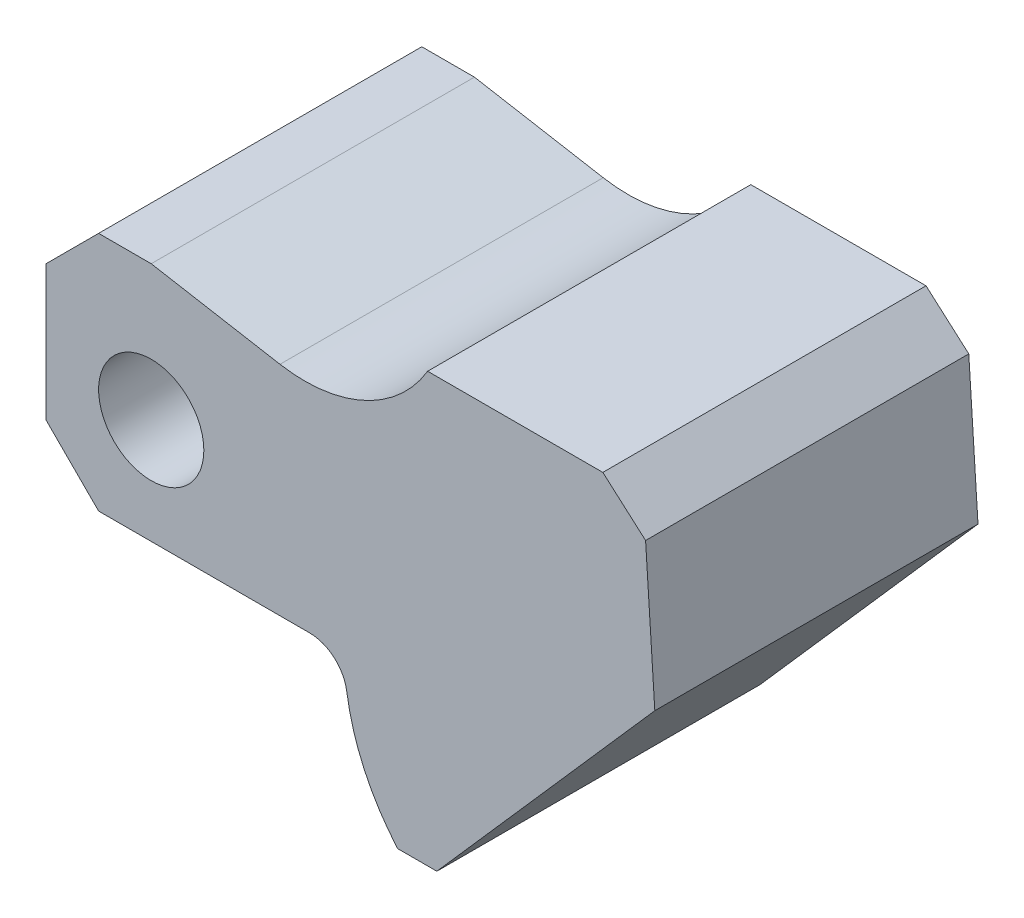
ISO-10303-21;
HEADER;
FILE_DESCRIPTION(('STEP AP214'),'2;1');
FILE_NAME('part.step','',(''),(''),'','','');
FILE_SCHEMA(('AUTOMOTIVE_DESIGN { 1 0 10303 214 1 1 1 1 }'));
ENDSEC;
DATA;
#1=APPLICATION_CONTEXT('core data for automotive mechanical design processes');
#2=APPLICATION_PROTOCOL_DEFINITION('international standard','automotive_design',2000,#1);
#3=PRODUCT_CONTEXT('',#1,'mechanical');
#4=PRODUCT('Part','Part','',(#3));
#5=PRODUCT_RELATED_PRODUCT_CATEGORY('part','',(#4));
#6=PRODUCT_DEFINITION_FORMATION('','',#4);
#7=PRODUCT_DEFINITION_CONTEXT('part definition',#1,'design');
#8=PRODUCT_DEFINITION('design','',#6,#7);
#9=PRODUCT_DEFINITION_SHAPE('','',#8);
#10=(LENGTH_UNIT() NAMED_UNIT(*) SI_UNIT(.MILLI.,.METRE.));
#11=(NAMED_UNIT(*) PLANE_ANGLE_UNIT() SI_UNIT($,.RADIAN.));
#12=(NAMED_UNIT(*) SI_UNIT($,.STERADIAN.) SOLID_ANGLE_UNIT());
#13=UNCERTAINTY_MEASURE_WITH_UNIT(LENGTH_MEASURE(1.E-05),#10,'distance_accuracy_value','');
#14=(GEOMETRIC_REPRESENTATION_CONTEXT(3) GLOBAL_UNCERTAINTY_ASSIGNED_CONTEXT((#13)) GLOBAL_UNIT_ASSIGNED_CONTEXT((#10,
#11,#12)) REPRESENTATION_CONTEXT('',''));
#15=CARTESIAN_POINT('',(0.,0.,0.));
#16=DIRECTION('',(0.,0.,1.));
#17=DIRECTION('',(1.,0.,0.));
#18=AXIS2_PLACEMENT_3D('',#15,#16,#17);
#19=CARTESIAN_POINT('',(28.0666262553692,-5.,43.));
#20=DIRECTION('',(0.,0.,1.));
#21=DIRECTION('',(1.,0.,0.));
#22=AXIS2_PLACEMENT_3D('',#19,#20,#21);
#23=PLANE('',#22);
#24=DIRECTION('',(1.,0.,0.));
#25=VECTOR('',#24,1.);
#26=CARTESIAN_POINT('',(0.,0.,43.));
#27=LINE('',#26,#25);
#28=CARTESIAN_POINT('',(0.,0.,43.));
#29=VERTEX_POINT('',#28);
#30=CARTESIAN_POINT('',(28.0666262553692,0.,43.));
#31=VERTEX_POINT('',#30);
#32=EDGE_CURVE('E222',#29,#31,#27,.T.);
#33=ORIENTED_EDGE('',*,*,#32,.T.);
#34=CARTESIAN_POINT('',(28.0666262553692,-5.,43.));
#35=DIRECTION('',(0.,0.,-1.));
#36=DIRECTION('',(1.,0.,0.));
#37=AXIS2_PLACEMENT_3D('',#34,#35,#36);
#38=CIRCLE('',#37,5.);
#39=CARTESIAN_POINT('',(33.012264996781,-4.26470588235294,43.));
#40=VERTEX_POINT('',#39);
#41=EDGE_CURVE('E122',#31,#40,#38,.T.);
#42=ORIENTED_EDGE('',*,*,#41,.T.);
#43=CARTESIAN_POINT('',(61.6969696969697,0.,43.));
#44=DIRECTION('',(0.,0.,1.));
#45=DIRECTION('',(1.,0.,0.));
#46=AXIS2_PLACEMENT_3D('',#43,#44,#45);
#47=CIRCLE('',#46,29.);
#48=CARTESIAN_POINT('',(39.788067396763,-19.,43.));
#49=VERTEX_POINT('',#48);
#50=EDGE_CURVE('E267',#40,#49,#47,.T.);
#51=ORIENTED_EDGE('',*,*,#50,.T.);
#52=DIRECTION('',(1.,0.,0.));
#53=VECTOR('',#52,1.);
#54=CARTESIAN_POINT('',(39.788067396763,-19.,43.));
#55=LINE('',#54,#53);
#56=CARTESIAN_POINT('',(45.,-19.,43.));
#57=VERTEX_POINT('',#56);
#58=EDGE_CURVE('E287',#49,#57,#55,.T.);
#59=ORIENTED_EDGE('',*,*,#58,.T.);
#60=DIRECTION('',(0.660114607728679,0.751164898449876,0.));
#61=VECTOR('',#60,1.);
#62=CARTESIAN_POINT('',(45.,-19.,43.));
#63=LINE('',#62,#61);
#64=CARTESIAN_POINT('',(74.,14.,43.));
#65=VERTEX_POINT('',#64);
#66=EDGE_CURVE('E283',#57,#65,#63,.T.);
#67=ORIENTED_EDGE('',*,*,#66,.T.);
#68=DIRECTION('',(-0.0643822779979676,0.997925308968458,0.));
#69=VECTOR('',#68,1.);
#70=CARTESIAN_POINT('',(74.,14.,43.));
#71=LINE('',#70,#69);
#72=CARTESIAN_POINT('',(72.774193548387,33.,43.));
#73=VERTEX_POINT('',#72);
#74=EDGE_CURVE('E286',#65,#73,#71,.T.);
#75=ORIENTED_EDGE('',*,*,#74,.T.);
#76=DIRECTION('',(-0.751164898449876,0.660114607728679,0.));
#77=VECTOR('',#76,1.);
#78=CARTESIAN_POINT('',(72.774193548387,33.,43.));
#79=LINE('',#78,#77);
#80=CARTESIAN_POINT('',(67.0845383759732,38.,43.));
#81=VERTEX_POINT('',#80);
#82=EDGE_CURVE('E291',#73,#81,#79,.T.);
#83=ORIENTED_EDGE('',*,*,#82,.T.);
#84=DIRECTION('',(-1.,0.,0.));
#85=VECTOR('',#84,1.);
#86=CARTESIAN_POINT('',(67.0845383759732,38.,43.));
#87=LINE('',#86,#85);
#88=CARTESIAN_POINT('',(43.774193548387,38.,43.));
#89=VERTEX_POINT('',#88);
#90=EDGE_CURVE('E298',#81,#89,#87,.T.);
#91=ORIENTED_EDGE('',*,*,#90,.T.);
#92=CARTESIAN_POINT('',(27.4311967812515,47.6905343851306,43.));
#93=DIRECTION('',(0.,0.,-1.));
#94=DIRECTION('',(1.,0.,0.));
#95=AXIS2_PLACEMENT_3D('',#92,#93,#94);
#96=CIRCLE('',#95,19.);
#97=CARTESIAN_POINT('',(24.1318814055799,28.9791870778986,43.));
#98=VERTEX_POINT('',#97);
#99=EDGE_CURVE('E301',#89,#98,#96,.T.);
#100=ORIENTED_EDGE('',*,*,#99,.T.);
#101=DIRECTION('',(-0.984807753012208,0.17364817766693,0.));
#102=VECTOR('',#101,1.);
#103=CARTESIAN_POINT('',(6.99999999999997,32.,43.));
#104=LINE('',#103,#102);
#105=CARTESIAN_POINT('',(6.99999999999997,32.,43.));
#106=VERTEX_POINT('',#105);
#107=EDGE_CURVE('E304',#98,#106,#104,.T.);
#108=ORIENTED_EDGE('',*,*,#107,.T.);
#109=DIRECTION('',(-1.,0.,0.));
#110=VECTOR('',#109,1.);
#111=CARTESIAN_POINT('',(0.,32.,43.));
#112=LINE('',#111,#110);
#113=CARTESIAN_POINT('',(0.,32.,43.));
#114=VERTEX_POINT('',#113);
#115=EDGE_CURVE('E159',#106,#114,#112,.T.);
#116=ORIENTED_EDGE('',*,*,#115,.T.);
#117=DIRECTION('',(-0.707106781186546,-0.707106781186549,0.));
#118=VECTOR('',#117,1.);
#119=CARTESIAN_POINT('',(-7.00000000000003,25.,43.));
#120=LINE('',#119,#118);
#121=CARTESIAN_POINT('',(-7.00000000000003,25.,43.));
#122=VERTEX_POINT('',#121);
#123=EDGE_CURVE('E153',#114,#122,#120,.T.);
#124=ORIENTED_EDGE('',*,*,#123,.T.);
#125=DIRECTION('',(0.,-1.,0.));
#126=VECTOR('',#125,1.);
#127=CARTESIAN_POINT('',(-7.00000000000003,7.,43.));
#128=LINE('',#127,#126);
#129=CARTESIAN_POINT('',(-7.00000000000003,7.,43.));
#130=VERTEX_POINT('',#129);
#131=EDGE_CURVE('E157',#122,#130,#128,.T.);
#132=ORIENTED_EDGE('',*,*,#131,.T.);
#133=DIRECTION('',(0.707106781186549,-0.707106781186546,0.));
#134=VECTOR('',#133,1.);
#135=CARTESIAN_POINT('',(0.,0.,43.));
#136=LINE('',#135,#134);
#137=EDGE_CURVE('E61',#130,#29,#136,.T.);
#138=ORIENTED_EDGE('',*,*,#137,.T.);
#139=EDGE_LOOP('',(#33,#42,#51,#59,#67,#75,#83,#91,#100,#108,#116,#124,#132,#138));
#140=FACE_BOUND('',#139,.T.);
#141=CARTESIAN_POINT('',(6.99999999999997,14.,43.));
#142=DIRECTION('',(0.,0.,1.));
#143=DIRECTION('',(1.,0.,0.));
#144=AXIS2_PLACEMENT_3D('',#141,#142,#143);
#145=CIRCLE('',#144,7.);
#146=CARTESIAN_POINT('',(14.,14.,43.));
#147=VERTEX_POINT('',#146);
#148=EDGE_CURVE('E186',#147,#147,#145,.T.);
#149=ORIENTED_EDGE('',*,*,#148,.F.);
#150=EDGE_LOOP('',(#149));
#151=FACE_BOUND('',#150,.T.);
#152=ADVANCED_FACE('F43',(#140,#151),#23,.T.);
#153=CARTESIAN_POINT('',(28.0666262553692,-5.,0.));
#154=DIRECTION('',(0.,0.,1.));
#155=DIRECTION('',(1.,0.,0.));
#156=AXIS2_PLACEMENT_3D('',#153,#154,#155);
#157=PLANE('',#156);
#158=DIRECTION('',(1.,0.,0.));
#159=VECTOR('',#158,1.);
#160=CARTESIAN_POINT('',(0.,0.,0.));
#161=LINE('',#160,#159);
#162=CARTESIAN_POINT('',(0.,0.,0.));
#163=VERTEX_POINT('',#162);
#164=CARTESIAN_POINT('',(28.0666262553692,0.,0.));
#165=VERTEX_POINT('',#164);
#166=EDGE_CURVE('E181',#163,#165,#161,.T.);
#167=ORIENTED_EDGE('',*,*,#166,.F.);
#168=DIRECTION('',(0.707106781186549,-0.707106781186546,0.));
#169=VECTOR('',#168,1.);
#170=CARTESIAN_POINT('',(0.,0.,0.));
#171=LINE('',#170,#169);
#172=CARTESIAN_POINT('',(-7.00000000000003,7.,0.));
#173=VERTEX_POINT('',#172);
#174=EDGE_CURVE('E114',#173,#163,#171,.T.);
#175=ORIENTED_EDGE('',*,*,#174,.F.);
#176=DIRECTION('',(0.,-1.,0.));
#177=VECTOR('',#176,1.);
#178=CARTESIAN_POINT('',(-7.00000000000003,7.,0.));
#179=LINE('',#178,#177);
#180=CARTESIAN_POINT('',(-7.00000000000003,25.,0.));
#181=VERTEX_POINT('',#180);
#182=EDGE_CURVE('E108',#181,#173,#179,.T.);
#183=ORIENTED_EDGE('',*,*,#182,.F.);
#184=DIRECTION('',(-0.707106781186546,-0.707106781186549,0.));
#185=VECTOR('',#184,1.);
#186=CARTESIAN_POINT('',(-7.00000000000003,25.,0.));
#187=LINE('',#186,#185);
#188=CARTESIAN_POINT('',(0.,32.,0.));
#189=VERTEX_POINT('',#188);
#190=EDGE_CURVE('E168',#189,#181,#187,.T.);
#191=ORIENTED_EDGE('',*,*,#190,.F.);
#192=DIRECTION('',(-1.,0.,0.));
#193=VECTOR('',#192,1.);
#194=CARTESIAN_POINT('',(0.,32.,0.));
#195=LINE('',#194,#193);
#196=CARTESIAN_POINT('',(6.99999999999997,32.,0.));
#197=VERTEX_POINT('',#196);
#198=EDGE_CURVE('E213',#197,#189,#195,.T.);
#199=ORIENTED_EDGE('',*,*,#198,.F.);
#200=DIRECTION('',(-0.984807753012208,0.17364817766693,0.));
#201=VECTOR('',#200,1.);
#202=CARTESIAN_POINT('',(6.99999999999997,32.,0.));
#203=LINE('',#202,#201);
#204=CARTESIAN_POINT('',(24.1318814055799,28.9791870778986,0.));
#205=VERTEX_POINT('',#204);
#206=EDGE_CURVE('E210',#205,#197,#203,.T.);
#207=ORIENTED_EDGE('',*,*,#206,.F.);
#208=CARTESIAN_POINT('',(27.4311967812515,47.6905343851306,0.));
#209=DIRECTION('',(0.,0.,-1.));
#210=DIRECTION('',(1.,0.,0.));
#211=AXIS2_PLACEMENT_3D('',#208,#209,#210);
#212=CIRCLE('',#211,19.);
#213=CARTESIAN_POINT('',(43.774193548387,38.,0.));
#214=VERTEX_POINT('',#213);
#215=EDGE_CURVE('E207',#214,#205,#212,.T.);
#216=ORIENTED_EDGE('',*,*,#215,.F.);
#217=DIRECTION('',(-1.,0.,0.));
#218=VECTOR('',#217,1.);
#219=CARTESIAN_POINT('',(67.0845383759732,38.,0.));
#220=LINE('',#219,#218);
#221=CARTESIAN_POINT('',(67.0845383759732,38.,0.));
#222=VERTEX_POINT('',#221);
#223=EDGE_CURVE('E204',#222,#214,#220,.T.);
#224=ORIENTED_EDGE('',*,*,#223,.F.);
#225=DIRECTION('',(-0.751164898449876,0.660114607728679,0.));
#226=VECTOR('',#225,1.);
#227=CARTESIAN_POINT('',(72.774193548387,33.,0.));
#228=LINE('',#227,#226);
#229=CARTESIAN_POINT('',(72.774193548387,33.,0.));
#230=VERTEX_POINT('',#229);
#231=EDGE_CURVE('E201',#230,#222,#228,.T.);
#232=ORIENTED_EDGE('',*,*,#231,.F.);
#233=DIRECTION('',(-0.0643822779979676,0.997925308968458,0.));
#234=VECTOR('',#233,1.);
#235=CARTESIAN_POINT('',(74.,14.,0.));
#236=LINE('',#235,#234);
#237=CARTESIAN_POINT('',(74.,14.,0.));
#238=VERTEX_POINT('',#237);
#239=EDGE_CURVE('E198',#238,#230,#236,.T.);
#240=ORIENTED_EDGE('',*,*,#239,.F.);
#241=DIRECTION('',(0.660114607728679,0.751164898449876,0.));
#242=VECTOR('',#241,1.);
#243=CARTESIAN_POINT('',(45.,-19.,0.));
#244=LINE('',#243,#242);
#245=CARTESIAN_POINT('',(45.,-19.,0.));
#246=VERTEX_POINT('',#245);
#247=EDGE_CURVE('E195',#246,#238,#244,.T.);
#248=ORIENTED_EDGE('',*,*,#247,.F.);
#249=DIRECTION('',(1.,0.,0.));
#250=VECTOR('',#249,1.);
#251=CARTESIAN_POINT('',(39.788067396763,-19.,0.));
#252=LINE('',#251,#250);
#253=CARTESIAN_POINT('',(39.788067396763,-19.,0.));
#254=VERTEX_POINT('',#253);
#255=EDGE_CURVE('E192',#254,#246,#252,.T.);
#256=ORIENTED_EDGE('',*,*,#255,.F.);
#257=CARTESIAN_POINT('',(61.6969696969697,0.,0.));
#258=DIRECTION('',(0.,0.,1.));
#259=DIRECTION('',(1.,0.,0.));
#260=AXIS2_PLACEMENT_3D('',#257,#258,#259);
#261=CIRCLE('',#260,29.);
#262=CARTESIAN_POINT('',(33.012264996781,-4.26470588235294,0.));
#263=VERTEX_POINT('',#262);
#264=EDGE_CURVE('E189',#263,#254,#261,.T.);
#265=ORIENTED_EDGE('',*,*,#264,.F.);
#266=CARTESIAN_POINT('',(28.0666262553692,-5.,0.));
#267=DIRECTION('',(0.,0.,-1.));
#268=DIRECTION('',(1.,0.,0.));
#269=AXIS2_PLACEMENT_3D('',#266,#267,#268);
#270=CIRCLE('',#269,5.);
#271=EDGE_CURVE('E185',#165,#263,#270,.T.);
#272=ORIENTED_EDGE('',*,*,#271,.F.);
#273=EDGE_LOOP('',(#167,#175,#183,#191,#199,#207,#216,#224,#232,#240,#248,#256,#265,#272));
#274=FACE_BOUND('',#273,.T.);
#275=CARTESIAN_POINT('',(6.99999999999997,14.,0.));
#276=DIRECTION('',(0.,0.,1.));
#277=DIRECTION('',(1.,0.,0.));
#278=AXIS2_PLACEMENT_3D('',#275,#276,#277);
#279=CIRCLE('',#278,7.);
#280=CARTESIAN_POINT('',(14.,14.,0.));
#281=VERTEX_POINT('',#280);
#282=EDGE_CURVE('E513',#281,#281,#279,.T.);
#283=ORIENTED_EDGE('',*,*,#282,.T.);
#284=EDGE_LOOP('',(#283));
#285=FACE_BOUND('',#284,.T.);
#286=ADVANCED_FACE('F271',(#274,#285),#157,.F.);
#287=CARTESIAN_POINT('',(0.,0.,43.));
#288=DIRECTION('',(0.,1.,0.));
#289=DIRECTION('',(0.,0.,1.));
#290=AXIS2_PLACEMENT_3D('',#287,#288,#289);
#291=PLANE('',#290);
#292=ORIENTED_EDGE('',*,*,#166,.T.);
#293=DIRECTION('',(0.,0.,-1.));
#294=VECTOR('',#293,1.);
#295=CARTESIAN_POINT('',(28.0666262553692,0.,43.));
#296=LINE('',#295,#294);
#297=EDGE_CURVE('E11',#31,#165,#296,.T.);
#298=ORIENTED_EDGE('',*,*,#297,.F.);
#299=ORIENTED_EDGE('',*,*,#32,.F.);
#300=DIRECTION('',(0.,0.,-1.));
#301=VECTOR('',#300,1.);
#302=CARTESIAN_POINT('',(0.,0.,43.));
#303=LINE('',#302,#301);
#304=EDGE_CURVE('E177',#29,#163,#303,.T.);
#305=ORIENTED_EDGE('',*,*,#304,.T.);
#306=EDGE_LOOP('',(#292,#298,#299,#305));
#307=FACE_BOUND('',#306,.T.);
#308=ADVANCED_FACE('F45',(#307),#291,.F.);
#309=CARTESIAN_POINT('',(28.0666262553692,-5.,43.));
#310=DIRECTION('',(0.,0.,-1.));
#311=DIRECTION('',(-1.,0.,0.));
#312=AXIS2_PLACEMENT_3D('',#309,#310,#311);
#313=CYLINDRICAL_SURFACE('',#312,5.);
#314=ORIENTED_EDGE('',*,*,#271,.T.);
#315=DIRECTION('',(0.,0.,-1.));
#316=VECTOR('',#315,1.);
#317=CARTESIAN_POINT('',(33.012264996781,-4.26470588235294,43.));
#318=LINE('',#317,#316);
#319=EDGE_CURVE('E53',#40,#263,#318,.T.);
#320=ORIENTED_EDGE('',*,*,#319,.F.);
#321=ORIENTED_EDGE('',*,*,#41,.F.);
#322=ORIENTED_EDGE('',*,*,#297,.T.);
#323=EDGE_LOOP('',(#314,#320,#321,#322));
#324=FACE_BOUND('',#323,.T.);
#325=ADVANCED_FACE('F340',(#324),#313,.F.);
#326=CARTESIAN_POINT('',(61.6969696969697,0.,43.));
#327=DIRECTION('',(0.,0.,-1.));
#328=DIRECTION('',(-1.,0.,0.));
#329=AXIS2_PLACEMENT_3D('',#326,#327,#328);
#330=CYLINDRICAL_SURFACE('',#329,29.);
#331=ORIENTED_EDGE('',*,*,#264,.T.);
#332=DIRECTION('',(0.,0.,-1.));
#333=VECTOR('',#332,1.);
#334=CARTESIAN_POINT('',(39.788067396763,-19.,43.));
#335=LINE('',#334,#333);
#336=EDGE_CURVE('E257',#49,#254,#335,.T.);
#337=ORIENTED_EDGE('',*,*,#336,.F.);
#338=ORIENTED_EDGE('',*,*,#50,.F.);
#339=ORIENTED_EDGE('',*,*,#319,.T.);
#340=EDGE_LOOP('',(#331,#337,#338,#339));
#341=FACE_BOUND('',#340,.T.);
#342=ADVANCED_FACE('F265',(#341),#330,.T.);
#343=CARTESIAN_POINT('',(39.788067396763,-19.,43.));
#344=DIRECTION('',(0.,1.,0.));
#345=DIRECTION('',(-1.,0.,0.));
#346=AXIS2_PLACEMENT_3D('',#343,#344,#345);
#347=PLANE('',#346);
#348=ORIENTED_EDGE('',*,*,#255,.T.);
#349=DIRECTION('',(0.,0.,-1.));
#350=VECTOR('',#349,1.);
#351=CARTESIAN_POINT('',(45.,-19.,43.));
#352=LINE('',#351,#350);
#353=EDGE_CURVE('E253',#57,#246,#352,.T.);
#354=ORIENTED_EDGE('',*,*,#353,.F.);
#355=ORIENTED_EDGE('',*,*,#58,.F.);
#356=ORIENTED_EDGE('',*,*,#336,.T.);
#357=EDGE_LOOP('',(#348,#354,#355,#356));
#358=FACE_BOUND('',#357,.T.);
#359=ADVANCED_FACE('F277',(#358),#347,.F.);
#360=CARTESIAN_POINT('',(45.,-19.,43.));
#361=DIRECTION('',(-0.751164898449876,0.660114607728679,0.));
#362=DIRECTION('',(-0.660114607728679,-0.751164898449876,0.));
#363=AXIS2_PLACEMENT_3D('',#360,#361,#362);
#364=PLANE('',#363);
#365=ORIENTED_EDGE('',*,*,#247,.T.);
#366=DIRECTION('',(0.,0.,-1.));
#367=VECTOR('',#366,1.);
#368=CARTESIAN_POINT('',(74.,14.,43.));
#369=LINE('',#368,#367);
#370=EDGE_CURVE('E249',#65,#238,#369,.T.);
#371=ORIENTED_EDGE('',*,*,#370,.F.);
#372=ORIENTED_EDGE('',*,*,#66,.F.);
#373=ORIENTED_EDGE('',*,*,#353,.T.);
#374=EDGE_LOOP('',(#365,#371,#372,#373));
#375=FACE_BOUND('',#374,.T.);
#376=ADVANCED_FACE('F281',(#375),#364,.F.);
#377=CARTESIAN_POINT('',(74.,14.,43.));
#378=DIRECTION('',(-0.997925308968458,-0.0643822779979676,0.));
#379=DIRECTION('',(0.0643822779979676,-0.997925308968458,0.));
#380=AXIS2_PLACEMENT_3D('',#377,#378,#379);
#381=PLANE('',#380);
#382=ORIENTED_EDGE('',*,*,#239,.T.);
#383=DIRECTION('',(0.,0.,-1.));
#384=VECTOR('',#383,1.);
#385=CARTESIAN_POINT('',(72.774193548387,33.,43.));
#386=LINE('',#385,#384);
#387=EDGE_CURVE('E245',#73,#230,#386,.T.);
#388=ORIENTED_EDGE('',*,*,#387,.F.);
#389=ORIENTED_EDGE('',*,*,#74,.F.);
#390=ORIENTED_EDGE('',*,*,#370,.T.);
#391=EDGE_LOOP('',(#382,#388,#389,#390));
#392=FACE_BOUND('',#391,.T.);
#393=ADVANCED_FACE('F353',(#392),#381,.F.);
#394=CARTESIAN_POINT('',(72.774193548387,33.,43.));
#395=DIRECTION('',(-0.660114607728679,-0.751164898449876,0.));
#396=DIRECTION('',(0.751164898449876,-0.660114607728679,0.));
#397=AXIS2_PLACEMENT_3D('',#394,#395,#396);
#398=PLANE('',#397);
#399=ORIENTED_EDGE('',*,*,#231,.T.);
#400=DIRECTION('',(0.,0.,-1.));
#401=VECTOR('',#400,1.);
#402=CARTESIAN_POINT('',(67.0845383759732,38.,43.));
#403=LINE('',#402,#401);
#404=EDGE_CURVE('E241',#81,#222,#403,.T.);
#405=ORIENTED_EDGE('',*,*,#404,.F.);
#406=ORIENTED_EDGE('',*,*,#82,.F.);
#407=ORIENTED_EDGE('',*,*,#387,.T.);
#408=EDGE_LOOP('',(#399,#405,#406,#407));
#409=FACE_BOUND('',#408,.T.);
#410=ADVANCED_FACE('F356',(#409),#398,.F.);
#411=CARTESIAN_POINT('',(67.0845383759732,38.,43.));
#412=DIRECTION('',(0.,-1.,0.));
#413=DIRECTION('',(0.,0.,-1.));
#414=AXIS2_PLACEMENT_3D('',#411,#412,#413);
#415=PLANE('',#414);
#416=ORIENTED_EDGE('',*,*,#223,.T.);
#417=DIRECTION('',(0.,0.,-1.));
#418=VECTOR('',#417,1.);
#419=CARTESIAN_POINT('',(43.774193548387,38.,43.));
#420=LINE('',#419,#418);
#421=EDGE_CURVE('E237',#89,#214,#420,.T.);
#422=ORIENTED_EDGE('',*,*,#421,.F.);
#423=ORIENTED_EDGE('',*,*,#90,.F.);
#424=ORIENTED_EDGE('',*,*,#404,.T.);
#425=EDGE_LOOP('',(#416,#422,#423,#424));
#426=FACE_BOUND('',#425,.T.);
#427=ADVANCED_FACE('F360',(#426),#415,.F.);
#428=CARTESIAN_POINT('',(27.4311967812515,47.6905343851306,43.));
#429=DIRECTION('',(0.,0.,-1.));
#430=DIRECTION('',(-1.,0.,0.));
#431=AXIS2_PLACEMENT_3D('',#428,#429,#430);
#432=CYLINDRICAL_SURFACE('',#431,19.);
#433=ORIENTED_EDGE('',*,*,#215,.T.);
#434=DIRECTION('',(0.,0.,-1.));
#435=VECTOR('',#434,1.);
#436=CARTESIAN_POINT('',(24.1318814055799,28.9791870778986,43.));
#437=LINE('',#436,#435);
#438=EDGE_CURVE('E233',#98,#205,#437,.T.);
#439=ORIENTED_EDGE('',*,*,#438,.F.);
#440=ORIENTED_EDGE('',*,*,#99,.F.);
#441=ORIENTED_EDGE('',*,*,#421,.T.);
#442=EDGE_LOOP('',(#433,#439,#440,#441));
#443=FACE_BOUND('',#442,.T.);
#444=ADVANCED_FACE('F364',(#443),#432,.F.);
#445=CARTESIAN_POINT('',(6.99999999999997,32.,43.));
#446=DIRECTION('',(-0.17364817766693,-0.984807753012208,0.));
#447=DIRECTION('',(0.984807753012208,-0.17364817766693,0.));
#448=AXIS2_PLACEMENT_3D('',#445,#446,#447);
#449=PLANE('',#448);
#450=ORIENTED_EDGE('',*,*,#206,.T.);
#451=DIRECTION('',(0.,0.,-1.));
#452=VECTOR('',#451,1.);
#453=CARTESIAN_POINT('',(6.99999999999997,32.,43.));
#454=LINE('',#453,#452);
#455=EDGE_CURVE('E229',#106,#197,#454,.T.);
#456=ORIENTED_EDGE('',*,*,#455,.F.);
#457=ORIENTED_EDGE('',*,*,#107,.F.);
#458=ORIENTED_EDGE('',*,*,#438,.T.);
#459=EDGE_LOOP('',(#450,#456,#457,#458));
#460=FACE_BOUND('',#459,.T.);
#461=ADVANCED_FACE('F312',(#460),#449,.F.);
#462=CARTESIAN_POINT('',(0.,32.,43.));
#463=DIRECTION('',(0.,-1.,0.));
#464=DIRECTION('',(1.,0.,0.));
#465=AXIS2_PLACEMENT_3D('',#462,#463,#464);
#466=PLANE('',#465);
#467=ORIENTED_EDGE('',*,*,#198,.T.);
#468=DIRECTION('',(0.,0.,-1.));
#469=VECTOR('',#468,1.);
#470=CARTESIAN_POINT('',(0.,32.,43.));
#471=LINE('',#470,#469);
#472=EDGE_CURVE('E170',#114,#189,#471,.T.);
#473=ORIENTED_EDGE('',*,*,#472,.F.);
#474=ORIENTED_EDGE('',*,*,#115,.F.);
#475=ORIENTED_EDGE('',*,*,#455,.T.);
#476=EDGE_LOOP('',(#467,#473,#474,#475));
#477=FACE_BOUND('',#476,.T.);
#478=ADVANCED_FACE('F316',(#477),#466,.F.);
#479=CARTESIAN_POINT('',(-7.00000000000003,25.,43.));
#480=DIRECTION('',(0.707106781186549,-0.707106781186546,0.));
#481=DIRECTION('',(0.707106781186546,0.707106781186549,0.));
#482=AXIS2_PLACEMENT_3D('',#479,#480,#481);
#483=PLANE('',#482);
#484=ORIENTED_EDGE('',*,*,#190,.T.);
#485=DIRECTION('',(0.,0.,-1.));
#486=VECTOR('',#485,1.);
#487=CARTESIAN_POINT('',(-7.00000000000003,25.,43.));
#488=LINE('',#487,#486);
#489=EDGE_CURVE('E165',#122,#181,#488,.T.);
#490=ORIENTED_EDGE('',*,*,#489,.F.);
#491=ORIENTED_EDGE('',*,*,#123,.F.);
#492=ORIENTED_EDGE('',*,*,#472,.T.);
#493=EDGE_LOOP('',(#484,#490,#491,#492));
#494=FACE_BOUND('',#493,.T.);
#495=ADVANCED_FACE('F166',(#494),#483,.F.);
#496=CARTESIAN_POINT('',(-7.00000000000003,7.,43.));
#497=DIRECTION('',(1.,0.,0.));
#498=DIRECTION('',(0.,0.,-1.));
#499=AXIS2_PLACEMENT_3D('',#496,#497,#498);
#500=PLANE('',#499);
#501=ORIENTED_EDGE('',*,*,#182,.T.);
#502=DIRECTION('',(0.,0.,-1.));
#503=VECTOR('',#502,1.);
#504=CARTESIAN_POINT('',(-7.00000000000003,7.,43.));
#505=LINE('',#504,#503);
#506=EDGE_CURVE('E171',#130,#173,#505,.T.);
#507=ORIENTED_EDGE('',*,*,#506,.F.);
#508=ORIENTED_EDGE('',*,*,#131,.F.);
#509=ORIENTED_EDGE('',*,*,#489,.T.);
#510=EDGE_LOOP('',(#501,#507,#508,#509));
#511=FACE_BOUND('',#510,.T.);
#512=ADVANCED_FACE('F173',(#511),#500,.F.);
#513=CARTESIAN_POINT('',(0.,0.,43.));
#514=DIRECTION('',(0.707106781186546,0.707106781186549,0.));
#515=DIRECTION('',(-0.707106781186549,0.707106781186546,0.));
#516=AXIS2_PLACEMENT_3D('',#513,#514,#515);
#517=PLANE('',#516);
#518=ORIENTED_EDGE('',*,*,#174,.T.);
#519=ORIENTED_EDGE('',*,*,#304,.F.);
#520=ORIENTED_EDGE('',*,*,#137,.F.);
#521=ORIENTED_EDGE('',*,*,#506,.T.);
#522=EDGE_LOOP('',(#518,#519,#520,#521));
#523=FACE_BOUND('',#522,.T.);
#524=ADVANCED_FACE('F320',(#523),#517,.F.);
#525=CARTESIAN_POINT('',(6.99999999999997,14.,43.));
#526=DIRECTION('',(0.,0.,-1.));
#527=DIRECTION('',(-1.,0.,0.));
#528=AXIS2_PLACEMENT_3D('',#525,#526,#527);
#529=CYLINDRICAL_SURFACE('',#528,7.);
#530=ORIENTED_EDGE('',*,*,#148,.T.);
#531=EDGE_LOOP('',(#530));
#532=FACE_BOUND('',#531,.T.);
#533=ORIENTED_EDGE('',*,*,#282,.F.);
#534=EDGE_LOOP('',(#533));
#535=FACE_BOUND('',#534,.T.);
#536=ADVANCED_FACE('F322',(#532,#535),#529,.F.);
#537=CLOSED_SHELL('',(#152,#286,#308,#325,#342,#359,#376,#393,#410,#427,#444,#461,#478,#495,
#512,#524,#536));
#538=MANIFOLD_SOLID_BREP('B2',#537);
#539=ADVANCED_BREP_SHAPE_REPRESENTATION('',(#18,#538),#14);
#540=SHAPE_DEFINITION_REPRESENTATION(#9,#539);
ENDSEC;
END-ISO-10303-21;
